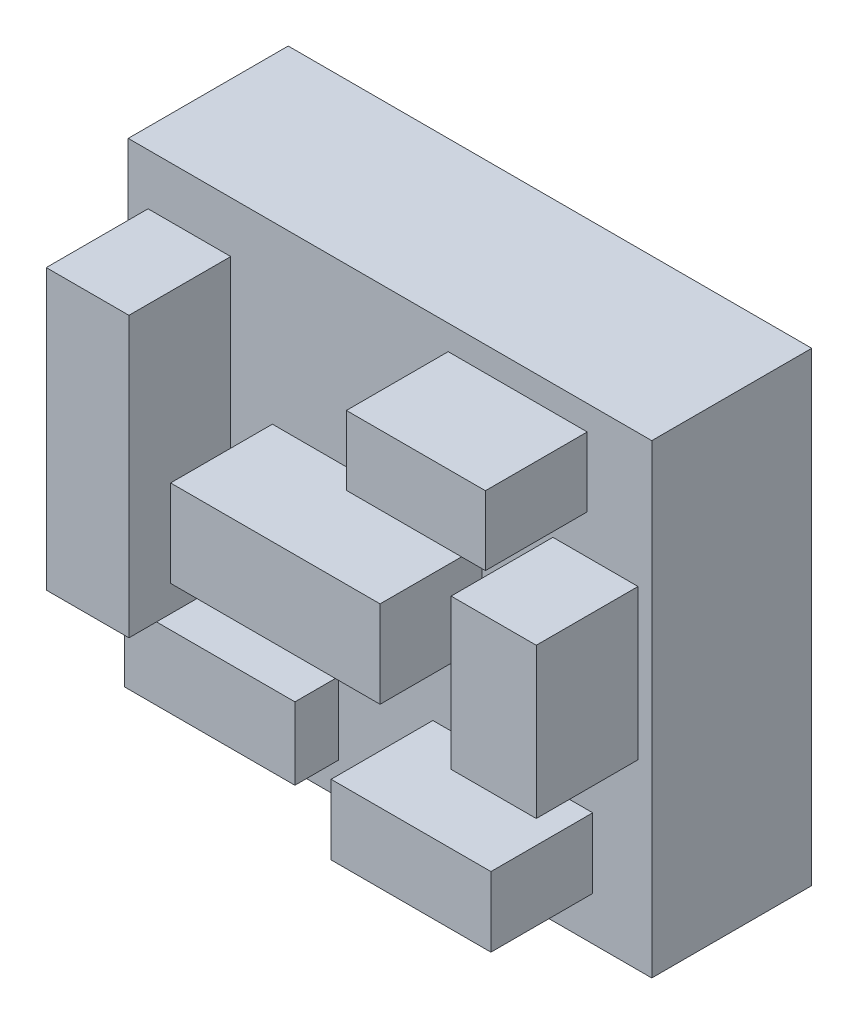
ISO-10303-21;
HEADER;
FILE_DESCRIPTION(('STEP AP214'),'2;1');
FILE_NAME('part.step','',(''),(''),'','','');
FILE_SCHEMA(('AUTOMOTIVE_DESIGN { 1 0 10303 214 1 1 1 1 }'));
ENDSEC;
DATA;
#1=APPLICATION_CONTEXT('core data for automotive mechanical design processes');
#2=APPLICATION_PROTOCOL_DEFINITION('international standard','automotive_design',2000,#1);
#3=PRODUCT_CONTEXT('',#1,'mechanical');
#4=PRODUCT('Part','Part','',(#3));
#5=PRODUCT_RELATED_PRODUCT_CATEGORY('part','',(#4));
#6=PRODUCT_DEFINITION_FORMATION('','',#4);
#7=PRODUCT_DEFINITION_CONTEXT('part definition',#1,'design');
#8=PRODUCT_DEFINITION('design','',#6,#7);
#9=PRODUCT_DEFINITION_SHAPE('','',#8);
#10=(LENGTH_UNIT() NAMED_UNIT(*) SI_UNIT(.MILLI.,.METRE.));
#11=(NAMED_UNIT(*) PLANE_ANGLE_UNIT() SI_UNIT($,.RADIAN.));
#12=(NAMED_UNIT(*) SI_UNIT($,.STERADIAN.) SOLID_ANGLE_UNIT());
#13=UNCERTAINTY_MEASURE_WITH_UNIT(LENGTH_MEASURE(1.E-05),#10,'distance_accuracy_value','');
#14=(GEOMETRIC_REPRESENTATION_CONTEXT(3) GLOBAL_UNCERTAINTY_ASSIGNED_CONTEXT((#13)) GLOBAL_UNIT_ASSIGNED_CONTEXT((#10,
#11,#12)) REPRESENTATION_CONTEXT('',''));
#15=CARTESIAN_POINT('',(0.,0.,0.));
#16=DIRECTION('',(0.,0.,1.));
#17=DIRECTION('',(1.,0.,0.));
#18=AXIS2_PLACEMENT_3D('',#15,#16,#17);
#19=CARTESIAN_POINT('',(0.,0.,13.97));
#20=DIRECTION('',(0.,0.,1.));
#21=DIRECTION('',(1.,0.,0.));
#22=AXIS2_PLACEMENT_3D('',#19,#20,#21);
#23=PLANE('',#22);
#24=DIRECTION('',(0.,-1.,0.));
#25=VECTOR('',#24,1.);
#26=CARTESIAN_POINT('',(-22.86,-20.32,13.97));
#27=LINE('',#26,#25);
#28=CARTESIAN_POINT('',(-22.86,20.32,13.97));
#29=VERTEX_POINT('',#28);
#30=CARTESIAN_POINT('',(-22.86,-20.32,13.97));
#31=VERTEX_POINT('',#30);
#32=EDGE_CURVE('E394',#29,#31,#27,.T.);
#33=ORIENTED_EDGE('',*,*,#32,.T.);
#34=DIRECTION('',(1.,0.,0.));
#35=VECTOR('',#34,1.);
#36=CARTESIAN_POINT('',(22.86,-20.32,13.97));
#37=LINE('',#36,#35);
#38=CARTESIAN_POINT('',(22.86,-20.32,13.97));
#39=VERTEX_POINT('',#38);
#40=EDGE_CURVE('E397',#31,#39,#37,.T.);
#41=ORIENTED_EDGE('',*,*,#40,.T.);
#42=DIRECTION('',(0.,1.,0.));
#43=VECTOR('',#42,1.);
#44=CARTESIAN_POINT('',(22.86,-20.32,13.97));
#45=LINE('',#44,#43);
#46=CARTESIAN_POINT('',(22.86,20.32,13.97));
#47=VERTEX_POINT('',#46);
#48=EDGE_CURVE('E400',#39,#47,#45,.T.);
#49=ORIENTED_EDGE('',*,*,#48,.T.);
#50=DIRECTION('',(-1.,0.,0.));
#51=VECTOR('',#50,1.);
#52=CARTESIAN_POINT('',(22.86,20.32,13.97));
#53=LINE('',#52,#51);
#54=EDGE_CURVE('E402',#47,#29,#53,.T.);
#55=ORIENTED_EDGE('',*,*,#54,.T.);
#56=EDGE_LOOP('',(#33,#41,#49,#55));
#57=FACE_BOUND('',#56,.T.);
#58=DIRECTION('',(1.,0.,0.));
#59=VECTOR('',#58,1.);
#60=CARTESIAN_POINT('',(-21.1277911757091,-8.53134858867236,13.97));
#61=LINE('',#60,#59);
#62=CARTESIAN_POINT('',(-21.1277911757091,-8.53134858867236,13.97));
#63=VERTEX_POINT('',#62);
#64=CARTESIAN_POINT('',(-13.9069005207199,-8.53134858867236,13.97));
#65=VERTEX_POINT('',#64);
#66=EDGE_CURVE('E378',#63,#65,#61,.T.);
#67=ORIENTED_EDGE('',*,*,#66,.F.);
#68=DIRECTION('',(0.,-1.,0.));
#69=VECTOR('',#68,1.);
#70=CARTESIAN_POINT('',(-21.1277911757091,15.8592154015133,13.97));
#71=LINE('',#70,#69);
#72=CARTESIAN_POINT('',(-21.1277911757091,15.8592154015133,13.97));
#73=VERTEX_POINT('',#72);
#74=EDGE_CURVE('E364',#73,#63,#71,.T.);
#75=ORIENTED_EDGE('',*,*,#74,.F.);
#76=DIRECTION('',(-1.,0.,0.));
#77=VECTOR('',#76,1.);
#78=CARTESIAN_POINT('',(-21.1277911757091,15.8592154015133,13.97));
#79=LINE('',#78,#77);
#80=CARTESIAN_POINT('',(-13.9069005207199,15.8592154015133,13.97));
#81=VERTEX_POINT('',#80);
#82=EDGE_CURVE('E369',#81,#73,#79,.T.);
#83=ORIENTED_EDGE('',*,*,#82,.F.);
#84=DIRECTION('',(0.,1.,0.));
#85=VECTOR('',#84,1.);
#86=CARTESIAN_POINT('',(-13.9069005207199,15.8592154015133,13.97));
#87=LINE('',#86,#85);
#88=EDGE_CURVE('E380',#65,#81,#87,.T.);
#89=ORIENTED_EDGE('',*,*,#88,.F.);
#90=EDGE_LOOP('',(#67,#75,#83,#89));
#91=FACE_BOUND('',#90,.T.);
#92=DIRECTION('',(1.,0.,0.));
#93=VECTOR('',#92,1.);
#94=CARTESIAN_POINT('',(5.08136749795535,12.1150498767041,13.97));
#95=LINE('',#94,#93);
#96=CARTESIAN_POINT('',(5.08136749795535,12.1150498767041,13.97));
#97=VERTEX_POINT('',#96);
#98=CARTESIAN_POINT('',(17.2231614141223,12.1150498767041,13.97));
#99=VERTEX_POINT('',#98);
#100=EDGE_CURVE('E349',#97,#99,#95,.T.);
#101=ORIENTED_EDGE('',*,*,#100,.F.);
#102=DIRECTION('',(0.,-1.,0.));
#103=VECTOR('',#102,1.);
#104=CARTESIAN_POINT('',(5.08136749795535,18.1592027953247,13.97));
#105=LINE('',#104,#103);
#106=CARTESIAN_POINT('',(5.08136749795535,18.1592027953247,13.97));
#107=VERTEX_POINT('',#106);
#108=EDGE_CURVE('E335',#107,#97,#105,.T.);
#109=ORIENTED_EDGE('',*,*,#108,.F.);
#110=DIRECTION('',(-1.,0.,0.));
#111=VECTOR('',#110,1.);
#112=CARTESIAN_POINT('',(5.08136749795535,18.1592027953247,13.97));
#113=LINE('',#112,#111);
#114=CARTESIAN_POINT('',(17.2231614141223,18.1592027953247,13.97));
#115=VERTEX_POINT('',#114);
#116=EDGE_CURVE('E340',#115,#107,#113,.T.);
#117=ORIENTED_EDGE('',*,*,#116,.F.);
#118=DIRECTION('',(0.,1.,0.));
#119=VECTOR('',#118,1.);
#120=CARTESIAN_POINT('',(17.2231614141223,18.1592027953247,13.97));
#121=LINE('',#120,#119);
#122=EDGE_CURVE('E351',#99,#115,#121,.T.);
#123=ORIENTED_EDGE('',*,*,#122,.F.);
#124=EDGE_LOOP('',(#101,#109,#117,#123));
#125=FACE_BOUND('',#124,.T.);
#126=DIRECTION('',(1.,0.,0.));
#127=VECTOR('',#126,1.);
#128=CARTESIAN_POINT('',(14.227828994275,-4.41276651138223,13.97));
#129=LINE('',#128,#127);
#130=CARTESIAN_POINT('',(14.227828994275,-4.41276651138223,13.97));
#131=VERTEX_POINT('',#130);
#132=CARTESIAN_POINT('',(21.6626719649675,-4.41276651138223,13.97));
#133=VERTEX_POINT('',#132);
#134=EDGE_CURVE('E320',#131,#133,#129,.T.);
#135=ORIENTED_EDGE('',*,*,#134,.F.);
#136=DIRECTION('',(0.,-1.,0.));
#137=VECTOR('',#136,1.);
#138=CARTESIAN_POINT('',(14.227828994275,8.69181282544999,13.97));
#139=LINE('',#138,#137);
#140=CARTESIAN_POINT('',(14.227828994275,8.69181282544999,13.97));
#141=VERTEX_POINT('',#140);
#142=EDGE_CURVE('E306',#141,#131,#139,.T.);
#143=ORIENTED_EDGE('',*,*,#142,.F.);
#144=DIRECTION('',(-1.,0.,0.));
#145=VECTOR('',#144,1.);
#146=CARTESIAN_POINT('',(14.227828994275,8.69181282544999,13.97));
#147=LINE('',#146,#145);
#148=CARTESIAN_POINT('',(21.6626719649675,8.69181282544999,13.97));
#149=VERTEX_POINT('',#148);
#150=EDGE_CURVE('E311',#149,#141,#147,.T.);
#151=ORIENTED_EDGE('',*,*,#150,.F.);
#152=DIRECTION('',(0.,1.,0.));
#153=VECTOR('',#152,1.);
#154=CARTESIAN_POINT('',(21.6626719649675,8.69181282544999,13.97));
#155=LINE('',#154,#153);
#156=EDGE_CURVE('E322',#133,#149,#155,.T.);
#157=ORIENTED_EDGE('',*,*,#156,.F.);
#158=EDGE_LOOP('',(#135,#143,#151,#157));
#159=FACE_BOUND('',#158,.T.);
#160=DIRECTION('',(1.,0.,0.));
#161=VECTOR('',#160,1.);
#162=CARTESIAN_POINT('',(3.7441655248092,-16.5010723486234,13.97));
#163=LINE('',#162,#161);
#164=CARTESIAN_POINT('',(3.7441655248092,-16.5010723486234,13.97));
#165=VERTEX_POINT('',#164);
#166=CARTESIAN_POINT('',(17.704554124455,-16.5010723486234,13.97));
#167=VERTEX_POINT('',#166);
#168=EDGE_CURVE('E291',#165,#167,#163,.T.);
#169=ORIENTED_EDGE('',*,*,#168,.F.);
#170=DIRECTION('',(0.,-1.,0.));
#171=VECTOR('',#170,1.);
#172=CARTESIAN_POINT('',(3.7441655248092,-10.403431351077,13.97));
#173=LINE('',#172,#171);
#174=CARTESIAN_POINT('',(3.7441655248092,-10.403431351077,13.97));
#175=VERTEX_POINT('',#174);
#176=EDGE_CURVE('E277',#175,#165,#173,.T.);
#177=ORIENTED_EDGE('',*,*,#176,.F.);
#178=DIRECTION('',(-1.,0.,0.));
#179=VECTOR('',#178,1.);
#180=CARTESIAN_POINT('',(3.7441655248092,-10.403431351077,13.97));
#181=LINE('',#180,#179);
#182=CARTESIAN_POINT('',(17.704554124455,-10.403431351077,13.97));
#183=VERTEX_POINT('',#182);
#184=EDGE_CURVE('E282',#183,#175,#181,.T.);
#185=ORIENTED_EDGE('',*,*,#184,.F.);
#186=DIRECTION('',(0.,1.,0.));
#187=VECTOR('',#186,1.);
#188=CARTESIAN_POINT('',(17.704554124455,-10.403431351077,13.97));
#189=LINE('',#188,#187);
#190=EDGE_CURVE('E293',#167,#183,#189,.T.);
#191=ORIENTED_EDGE('',*,*,#190,.F.);
#192=EDGE_LOOP('',(#169,#177,#185,#191));
#193=FACE_BOUND('',#192,.T.);
#194=DIRECTION('',(1.,0.,0.));
#195=VECTOR('',#194,1.);
#196=CARTESIAN_POINT('',(-10.2697111537624,-2.59417182790348,13.97));
#197=LINE('',#196,#195);
#198=CARTESIAN_POINT('',(-10.2697111537624,-2.59417182790348,13.97));
#199=VERTEX_POINT('',#198);
#200=CARTESIAN_POINT('',(8.02321183887687,-2.59417182790348,13.97));
#201=VERTEX_POINT('',#200);
#202=EDGE_CURVE('E249',#199,#201,#197,.T.);
#203=ORIENTED_EDGE('',*,*,#202,.F.);
#204=DIRECTION('',(0.,-1.,0.));
#205=VECTOR('',#204,1.);
#206=CARTESIAN_POINT('',(-10.2697111537624,5.00113537956662,13.97));
#207=LINE('',#206,#205);
#208=CARTESIAN_POINT('',(-10.2697111537624,5.00113537956662,13.97));
#209=VERTEX_POINT('',#208);
#210=EDGE_CURVE('E246',#209,#199,#207,.T.);
#211=ORIENTED_EDGE('',*,*,#210,.F.);
#212=DIRECTION('',(-1.,0.,0.));
#213=VECTOR('',#212,1.);
#214=CARTESIAN_POINT('',(-10.2697111537624,5.00113537956662,13.97));
#215=LINE('',#214,#213);
#216=CARTESIAN_POINT('',(8.02321183887687,5.00113537956662,13.97));
#217=VERTEX_POINT('',#216);
#218=EDGE_CURVE('E258',#217,#209,#215,.T.);
#219=ORIENTED_EDGE('',*,*,#218,.F.);
#220=DIRECTION('',(0.,1.,0.));
#221=VECTOR('',#220,1.);
#222=CARTESIAN_POINT('',(8.02321183887687,5.00113537956662,13.97));
#223=LINE('',#222,#221);
#224=EDGE_CURVE('E266',#201,#217,#223,.T.);
#225=ORIENTED_EDGE('',*,*,#224,.F.);
#226=EDGE_LOOP('',(#203,#211,#219,#225));
#227=FACE_BOUND('',#226,.T.);
#228=DIRECTION('',(1.,0.,0.));
#229=VECTOR('',#228,1.);
#230=CARTESIAN_POINT('',(-19.3626845711562,-17.5173458482145,13.97));
#231=LINE('',#230,#229);
#232=CARTESIAN_POINT('',(-19.3626845711562,-17.5173458482145,13.97));
#233=VERTEX_POINT('',#232);
#234=CARTESIAN_POINT('',(-4.49299862977105,-17.5173458482145,13.97));
#235=VERTEX_POINT('',#234);
#236=EDGE_CURVE('E785',#233,#235,#231,.T.);
#237=ORIENTED_EDGE('',*,*,#236,.F.);
#238=DIRECTION('',(0.,-1.,0.));
#239=VECTOR('',#238,1.);
#240=CARTESIAN_POINT('',(-19.3626845711562,-11.2057525349647,13.97));
#241=LINE('',#240,#239);
#242=CARTESIAN_POINT('',(-19.3626845711562,-11.2057525349647,13.97));
#243=VERTEX_POINT('',#242);
#244=EDGE_CURVE('E244',#243,#233,#241,.T.);
#245=ORIENTED_EDGE('',*,*,#244,.F.);
#246=DIRECTION('',(-1.,0.,0.));
#247=VECTOR('',#246,1.);
#248=CARTESIAN_POINT('',(-19.3626845711562,-11.2057525349647,13.97));
#249=LINE('',#248,#247);
#250=CARTESIAN_POINT('',(-4.49299862977105,-11.2057525349647,13.97));
#251=VERTEX_POINT('',#250);
#252=EDGE_CURVE('E240',#251,#243,#249,.T.);
#253=ORIENTED_EDGE('',*,*,#252,.F.);
#254=DIRECTION('',(0.,1.,0.));
#255=VECTOR('',#254,1.);
#256=CARTESIAN_POINT('',(-4.49299862977105,-11.2057525349647,13.97));
#257=LINE('',#256,#255);
#258=EDGE_CURVE('E782',#235,#251,#257,.T.);
#259=ORIENTED_EDGE('',*,*,#258,.F.);
#260=EDGE_LOOP('',(#237,#245,#253,#259));
#261=FACE_BOUND('',#260,.T.);
#262=ADVANCED_FACE('F35',(#57,#91,#125,#159,#193,#227,#261),#23,.T.);
#263=CARTESIAN_POINT('',(-22.86,-20.32,13.97));
#264=DIRECTION('',(1.,0.,0.));
#265=DIRECTION('',(0.,0.,-1.));
#266=AXIS2_PLACEMENT_3D('',#263,#264,#265);
#267=PLANE('',#266);
#268=DIRECTION('',(0.,-1.,0.));
#269=VECTOR('',#268,1.);
#270=CARTESIAN_POINT('',(-22.86,-20.32,0.));
#271=LINE('',#270,#269);
#272=CARTESIAN_POINT('',(-22.86,20.32,0.));
#273=VERTEX_POINT('',#272);
#274=CARTESIAN_POINT('',(-22.86,-20.32,0.));
#275=VERTEX_POINT('',#274);
#276=EDGE_CURVE('E393',#273,#275,#271,.T.);
#277=ORIENTED_EDGE('',*,*,#276,.T.);
#278=DIRECTION('',(0.,0.,-1.));
#279=VECTOR('',#278,1.);
#280=CARTESIAN_POINT('',(-22.86,-20.32,13.97));
#281=LINE('',#280,#279);
#282=EDGE_CURVE('E11',#31,#275,#281,.T.);
#283=ORIENTED_EDGE('',*,*,#282,.F.);
#284=ORIENTED_EDGE('',*,*,#32,.F.);
#285=DIRECTION('',(0.,0.,-1.));
#286=VECTOR('',#285,1.);
#287=CARTESIAN_POINT('',(-22.86,20.32,13.97));
#288=LINE('',#287,#286);
#289=EDGE_CURVE('E404',#29,#273,#288,.T.);
#290=ORIENTED_EDGE('',*,*,#289,.T.);
#291=EDGE_LOOP('',(#277,#283,#284,#290));
#292=FACE_BOUND('',#291,.T.);
#293=ADVANCED_FACE('F37',(#292),#267,.F.);
#294=CARTESIAN_POINT('',(22.86,-20.32,13.97));
#295=DIRECTION('',(0.,1.,0.));
#296=DIRECTION('',(-1.,0.,0.));
#297=AXIS2_PLACEMENT_3D('',#294,#295,#296);
#298=PLANE('',#297);
#299=DIRECTION('',(1.,0.,0.));
#300=VECTOR('',#299,1.);
#301=CARTESIAN_POINT('',(22.86,-20.32,0.));
#302=LINE('',#301,#300);
#303=CARTESIAN_POINT('',(22.86,-20.32,0.));
#304=VERTEX_POINT('',#303);
#305=EDGE_CURVE('E407',#275,#304,#302,.T.);
#306=ORIENTED_EDGE('',*,*,#305,.T.);
#307=DIRECTION('',(0.,0.,-1.));
#308=VECTOR('',#307,1.);
#309=CARTESIAN_POINT('',(22.86,-20.32,13.97));
#310=LINE('',#309,#308);
#311=EDGE_CURVE('E43',#39,#304,#310,.T.);
#312=ORIENTED_EDGE('',*,*,#311,.F.);
#313=ORIENTED_EDGE('',*,*,#40,.F.);
#314=ORIENTED_EDGE('',*,*,#282,.T.);
#315=EDGE_LOOP('',(#306,#312,#313,#314));
#316=FACE_BOUND('',#315,.T.);
#317=ADVANCED_FACE('F437',(#316),#298,.F.);
#318=CARTESIAN_POINT('',(22.86,-20.32,13.97));
#319=DIRECTION('',(-1.,0.,0.));
#320=DIRECTION('',(0.,0.,1.));
#321=AXIS2_PLACEMENT_3D('',#318,#319,#320);
#322=PLANE('',#321);
#323=DIRECTION('',(0.,1.,0.));
#324=VECTOR('',#323,1.);
#325=CARTESIAN_POINT('',(22.86,-20.32,0.));
#326=LINE('',#325,#324);
#327=CARTESIAN_POINT('',(22.86,20.32,0.));
#328=VERTEX_POINT('',#327);
#329=EDGE_CURVE('E409',#304,#328,#326,.T.);
#330=ORIENTED_EDGE('',*,*,#329,.T.);
#331=DIRECTION('',(0.,0.,-1.));
#332=VECTOR('',#331,1.);
#333=CARTESIAN_POINT('',(22.86,20.32,13.97));
#334=LINE('',#333,#332);
#335=EDGE_CURVE('E414',#47,#328,#334,.T.);
#336=ORIENTED_EDGE('',*,*,#335,.F.);
#337=ORIENTED_EDGE('',*,*,#48,.F.);
#338=ORIENTED_EDGE('',*,*,#311,.T.);
#339=EDGE_LOOP('',(#330,#336,#337,#338));
#340=FACE_BOUND('',#339,.T.);
#341=ADVANCED_FACE('F421',(#340),#322,.F.);
#342=CARTESIAN_POINT('',(22.86,20.32,13.97));
#343=DIRECTION('',(0.,-1.,0.));
#344=DIRECTION('',(1.,0.,0.));
#345=AXIS2_PLACEMENT_3D('',#342,#343,#344);
#346=PLANE('',#345);
#347=DIRECTION('',(-1.,0.,0.));
#348=VECTOR('',#347,1.);
#349=CARTESIAN_POINT('',(22.86,20.32,0.));
#350=LINE('',#349,#348);
#351=EDGE_CURVE('E398',#328,#273,#350,.T.);
#352=ORIENTED_EDGE('',*,*,#351,.T.);
#353=ORIENTED_EDGE('',*,*,#289,.F.);
#354=ORIENTED_EDGE('',*,*,#54,.F.);
#355=ORIENTED_EDGE('',*,*,#335,.T.);
#356=EDGE_LOOP('',(#352,#353,#354,#355));
#357=FACE_BOUND('',#356,.T.);
#358=ADVANCED_FACE('F430',(#357),#346,.F.);
#359=CARTESIAN_POINT('',(0.,0.,0.));
#360=DIRECTION('',(0.,0.,1.));
#361=DIRECTION('',(1.,0.,0.));
#362=AXIS2_PLACEMENT_3D('',#359,#360,#361);
#363=PLANE('',#362);
#364=ORIENTED_EDGE('',*,*,#276,.F.);
#365=ORIENTED_EDGE('',*,*,#351,.F.);
#366=ORIENTED_EDGE('',*,*,#329,.F.);
#367=ORIENTED_EDGE('',*,*,#305,.F.);
#368=EDGE_LOOP('',(#364,#365,#366,#367));
#369=FACE_BOUND('',#368,.T.);
#370=ADVANCED_FACE('F427',(#369),#363,.F.);
#371=CARTESIAN_POINT('',(-21.1277911757091,15.8592154015133,22.86));
#372=DIRECTION('',(1.,0.,0.));
#373=DIRECTION('',(0.,0.,-1.));
#374=AXIS2_PLACEMENT_3D('',#371,#372,#373);
#375=PLANE('',#374);
#376=ORIENTED_EDGE('',*,*,#74,.T.);
#377=DIRECTION('',(0.,0.,-1.));
#378=VECTOR('',#377,1.);
#379=CARTESIAN_POINT('',(-21.1277911757091,-8.53134858867236,22.86));
#380=LINE('',#379,#378);
#381=CARTESIAN_POINT('',(-21.1277911757091,-8.53134858867236,22.86));
#382=VERTEX_POINT('',#381);
#383=EDGE_CURVE('E391',#382,#63,#380,.T.);
#384=ORIENTED_EDGE('',*,*,#383,.F.);
#385=DIRECTION('',(0.,-1.,0.));
#386=VECTOR('',#385,1.);
#387=CARTESIAN_POINT('',(-21.1277911757091,15.8592154015133,22.86));
#388=LINE('',#387,#386);
#389=CARTESIAN_POINT('',(-21.1277911757091,15.8592154015133,22.86));
#390=VERTEX_POINT('',#389);
#391=EDGE_CURVE('E365',#390,#382,#388,.T.);
#392=ORIENTED_EDGE('',*,*,#391,.F.);
#393=DIRECTION('',(0.,0.,-1.));
#394=VECTOR('',#393,1.);
#395=CARTESIAN_POINT('',(-21.1277911757091,15.8592154015133,22.86));
#396=LINE('',#395,#394);
#397=EDGE_CURVE('E375',#390,#73,#396,.T.);
#398=ORIENTED_EDGE('',*,*,#397,.T.);
#399=EDGE_LOOP('',(#376,#384,#392,#398));
#400=FACE_BOUND('',#399,.T.);
#401=ADVANCED_FACE('F450',(#400),#375,.F.);
#402=CARTESIAN_POINT('',(-21.1277911757091,-8.53134858867236,22.86));
#403=DIRECTION('',(0.,1.,0.));
#404=DIRECTION('',(0.,0.,1.));
#405=AXIS2_PLACEMENT_3D('',#402,#403,#404);
#406=PLANE('',#405);
#407=ORIENTED_EDGE('',*,*,#66,.T.);
#408=DIRECTION('',(0.,0.,-1.));
#409=VECTOR('',#408,1.);
#410=CARTESIAN_POINT('',(-13.9069005207199,-8.53134858867236,22.86));
#411=LINE('',#410,#409);
#412=CARTESIAN_POINT('',(-13.9069005207199,-8.53134858867236,22.86));
#413=VERTEX_POINT('',#412);
#414=EDGE_CURVE('E388',#413,#65,#411,.T.);
#415=ORIENTED_EDGE('',*,*,#414,.F.);
#416=DIRECTION('',(1.,0.,0.));
#417=VECTOR('',#416,1.);
#418=CARTESIAN_POINT('',(-21.1277911757091,-8.53134858867236,22.86));
#419=LINE('',#418,#417);
#420=EDGE_CURVE('E368',#382,#413,#419,.T.);
#421=ORIENTED_EDGE('',*,*,#420,.F.);
#422=ORIENTED_EDGE('',*,*,#383,.T.);
#423=EDGE_LOOP('',(#407,#415,#421,#422));
#424=FACE_BOUND('',#423,.T.);
#425=ADVANCED_FACE('F469',(#424),#406,.F.);
#426=CARTESIAN_POINT('',(-13.9069005207199,15.8592154015133,22.86));
#427=DIRECTION('',(-1.,0.,0.));
#428=DIRECTION('',(0.,0.,1.));
#429=AXIS2_PLACEMENT_3D('',#426,#427,#428);
#430=PLANE('',#429);
#431=ORIENTED_EDGE('',*,*,#88,.T.);
#432=DIRECTION('',(0.,0.,-1.));
#433=VECTOR('',#432,1.);
#434=CARTESIAN_POINT('',(-13.9069005207199,15.8592154015133,22.86));
#435=LINE('',#434,#433);
#436=CARTESIAN_POINT('',(-13.9069005207199,15.8592154015133,22.86));
#437=VERTEX_POINT('',#436);
#438=EDGE_CURVE('E386',#437,#81,#435,.T.);
#439=ORIENTED_EDGE('',*,*,#438,.F.);
#440=DIRECTION('',(0.,1.,0.));
#441=VECTOR('',#440,1.);
#442=CARTESIAN_POINT('',(-13.9069005207199,15.8592154015133,22.86));
#443=LINE('',#442,#441);
#444=EDGE_CURVE('E371',#413,#437,#443,.T.);
#445=ORIENTED_EDGE('',*,*,#444,.F.);
#446=ORIENTED_EDGE('',*,*,#414,.T.);
#447=EDGE_LOOP('',(#431,#439,#445,#446));
#448=FACE_BOUND('',#447,.T.);
#449=ADVANCED_FACE('F476',(#448),#430,.F.);
#450=CARTESIAN_POINT('',(-21.1277911757091,15.8592154015133,22.86));
#451=DIRECTION('',(0.,-1.,0.));
#452=DIRECTION('',(0.,0.,-1.));
#453=AXIS2_PLACEMENT_3D('',#450,#451,#452);
#454=PLANE('',#453);
#455=ORIENTED_EDGE('',*,*,#82,.T.);
#456=ORIENTED_EDGE('',*,*,#397,.F.);
#457=DIRECTION('',(-1.,0.,0.));
#458=VECTOR('',#457,1.);
#459=CARTESIAN_POINT('',(-21.1277911757091,15.8592154015133,22.86));
#460=LINE('',#459,#458);
#461=EDGE_CURVE('E373',#437,#390,#460,.T.);
#462=ORIENTED_EDGE('',*,*,#461,.F.);
#463=ORIENTED_EDGE('',*,*,#438,.T.);
#464=EDGE_LOOP('',(#455,#456,#462,#463));
#465=FACE_BOUND('',#464,.T.);
#466=ADVANCED_FACE('F483',(#465),#454,.F.);
#467=CARTESIAN_POINT('',(0.,0.,22.86));
#468=DIRECTION('',(0.,0.,1.));
#469=DIRECTION('',(1.,0.,0.));
#470=AXIS2_PLACEMENT_3D('',#467,#468,#469);
#471=PLANE('',#470);
#472=ORIENTED_EDGE('',*,*,#391,.T.);
#473=ORIENTED_EDGE('',*,*,#420,.T.);
#474=ORIENTED_EDGE('',*,*,#444,.T.);
#475=ORIENTED_EDGE('',*,*,#461,.T.);
#476=EDGE_LOOP('',(#472,#473,#474,#475));
#477=FACE_BOUND('',#476,.T.);
#478=ADVANCED_FACE('F491',(#477),#471,.T.);
#479=CARTESIAN_POINT('',(5.08136749795535,18.1592027953247,22.86));
#480=DIRECTION('',(1.,0.,0.));
#481=DIRECTION('',(0.,0.,-1.));
#482=AXIS2_PLACEMENT_3D('',#479,#480,#481);
#483=PLANE('',#482);
#484=ORIENTED_EDGE('',*,*,#108,.T.);
#485=DIRECTION('',(0.,0.,-1.));
#486=VECTOR('',#485,1.);
#487=CARTESIAN_POINT('',(5.08136749795535,12.1150498767041,22.86));
#488=LINE('',#487,#486);
#489=CARTESIAN_POINT('',(5.08136749795535,12.1150498767041,22.86));
#490=VERTEX_POINT('',#489);
#491=EDGE_CURVE('E362',#490,#97,#488,.T.);
#492=ORIENTED_EDGE('',*,*,#491,.F.);
#493=DIRECTION('',(0.,-1.,0.));
#494=VECTOR('',#493,1.);
#495=CARTESIAN_POINT('',(5.08136749795535,18.1592027953247,22.86));
#496=LINE('',#495,#494);
#497=CARTESIAN_POINT('',(5.08136749795535,18.1592027953247,22.86));
#498=VERTEX_POINT('',#497);
#499=EDGE_CURVE('E336',#498,#490,#496,.T.);
#500=ORIENTED_EDGE('',*,*,#499,.F.);
#501=DIRECTION('',(0.,0.,-1.));
#502=VECTOR('',#501,1.);
#503=CARTESIAN_POINT('',(5.08136749795535,18.1592027953247,22.86));
#504=LINE('',#503,#502);
#505=EDGE_CURVE('E346',#498,#107,#504,.T.);
#506=ORIENTED_EDGE('',*,*,#505,.T.);
#507=EDGE_LOOP('',(#484,#492,#500,#506));
#508=FACE_BOUND('',#507,.T.);
#509=ADVANCED_FACE('F499',(#508),#483,.F.);
#510=CARTESIAN_POINT('',(5.08136749795535,12.1150498767041,22.86));
#511=DIRECTION('',(0.,1.,0.));
#512=DIRECTION('',(0.,0.,1.));
#513=AXIS2_PLACEMENT_3D('',#510,#511,#512);
#514=PLANE('',#513);
#515=ORIENTED_EDGE('',*,*,#100,.T.);
#516=DIRECTION('',(0.,0.,-1.));
#517=VECTOR('',#516,1.);
#518=CARTESIAN_POINT('',(17.2231614141223,12.1150498767041,22.86));
#519=LINE('',#518,#517);
#520=CARTESIAN_POINT('',(17.2231614141223,12.1150498767041,22.86));
#521=VERTEX_POINT('',#520);
#522=EDGE_CURVE('E359',#521,#99,#519,.T.);
#523=ORIENTED_EDGE('',*,*,#522,.F.);
#524=DIRECTION('',(1.,0.,0.));
#525=VECTOR('',#524,1.);
#526=CARTESIAN_POINT('',(5.08136749795535,12.1150498767041,22.86));
#527=LINE('',#526,#525);
#528=EDGE_CURVE('E339',#490,#521,#527,.T.);
#529=ORIENTED_EDGE('',*,*,#528,.F.);
#530=ORIENTED_EDGE('',*,*,#491,.T.);
#531=EDGE_LOOP('',(#515,#523,#529,#530));
#532=FACE_BOUND('',#531,.T.);
#533=ADVANCED_FACE('F507',(#532),#514,.F.);
#534=CARTESIAN_POINT('',(17.2231614141223,18.1592027953247,22.86));
#535=DIRECTION('',(-1.,0.,0.));
#536=DIRECTION('',(0.,-1.,0.));
#537=AXIS2_PLACEMENT_3D('',#534,#535,#536);
#538=PLANE('',#537);
#539=ORIENTED_EDGE('',*,*,#122,.T.);
#540=DIRECTION('',(0.,0.,-1.));
#541=VECTOR('',#540,1.);
#542=CARTESIAN_POINT('',(17.2231614141223,18.1592027953247,22.86));
#543=LINE('',#542,#541);
#544=CARTESIAN_POINT('',(17.2231614141223,18.1592027953247,22.86));
#545=VERTEX_POINT('',#544);
#546=EDGE_CURVE('E357',#545,#115,#543,.T.);
#547=ORIENTED_EDGE('',*,*,#546,.F.);
#548=DIRECTION('',(0.,1.,0.));
#549=VECTOR('',#548,1.);
#550=CARTESIAN_POINT('',(17.2231614141223,18.1592027953247,22.86));
#551=LINE('',#550,#549);
#552=EDGE_CURVE('E342',#521,#545,#551,.T.);
#553=ORIENTED_EDGE('',*,*,#552,.F.);
#554=ORIENTED_EDGE('',*,*,#522,.T.);
#555=EDGE_LOOP('',(#539,#547,#553,#554));
#556=FACE_BOUND('',#555,.T.);
#557=ADVANCED_FACE('F515',(#556),#538,.F.);
#558=CARTESIAN_POINT('',(5.08136749795535,18.1592027953247,22.86));
#559=DIRECTION('',(0.,-1.,0.));
#560=DIRECTION('',(0.,0.,-1.));
#561=AXIS2_PLACEMENT_3D('',#558,#559,#560);
#562=PLANE('',#561);
#563=ORIENTED_EDGE('',*,*,#116,.T.);
#564=ORIENTED_EDGE('',*,*,#505,.F.);
#565=DIRECTION('',(-1.,0.,0.));
#566=VECTOR('',#565,1.);
#567=CARTESIAN_POINT('',(5.08136749795535,18.1592027953247,22.86));
#568=LINE('',#567,#566);
#569=EDGE_CURVE('E344',#545,#498,#568,.T.);
#570=ORIENTED_EDGE('',*,*,#569,.F.);
#571=ORIENTED_EDGE('',*,*,#546,.T.);
#572=EDGE_LOOP('',(#563,#564,#570,#571));
#573=FACE_BOUND('',#572,.T.);
#574=ADVANCED_FACE('F523',(#573),#562,.F.);
#575=CARTESIAN_POINT('',(0.,0.,22.86));
#576=DIRECTION('',(0.,0.,1.));
#577=DIRECTION('',(1.,0.,0.));
#578=AXIS2_PLACEMENT_3D('',#575,#576,#577);
#579=PLANE('',#578);
#580=ORIENTED_EDGE('',*,*,#499,.T.);
#581=ORIENTED_EDGE('',*,*,#528,.T.);
#582=ORIENTED_EDGE('',*,*,#552,.T.);
#583=ORIENTED_EDGE('',*,*,#569,.T.);
#584=EDGE_LOOP('',(#580,#581,#582,#583));
#585=FACE_BOUND('',#584,.T.);
#586=ADVANCED_FACE('F531',(#585),#579,.T.);
#587=CARTESIAN_POINT('',(14.227828994275,8.69181282544999,22.86));
#588=DIRECTION('',(1.,0.,0.));
#589=DIRECTION('',(0.,0.,-1.));
#590=AXIS2_PLACEMENT_3D('',#587,#588,#589);
#591=PLANE('',#590);
#592=ORIENTED_EDGE('',*,*,#142,.T.);
#593=DIRECTION('',(0.,0.,-1.));
#594=VECTOR('',#593,1.);
#595=CARTESIAN_POINT('',(14.227828994275,-4.41276651138223,22.86));
#596=LINE('',#595,#594);
#597=CARTESIAN_POINT('',(14.227828994275,-4.41276651138223,22.86));
#598=VERTEX_POINT('',#597);
#599=EDGE_CURVE('E333',#598,#131,#596,.T.);
#600=ORIENTED_EDGE('',*,*,#599,.F.);
#601=DIRECTION('',(0.,-1.,0.));
#602=VECTOR('',#601,1.);
#603=CARTESIAN_POINT('',(14.227828994275,8.69181282544999,22.86));
#604=LINE('',#603,#602);
#605=CARTESIAN_POINT('',(14.227828994275,8.69181282544999,22.86));
#606=VERTEX_POINT('',#605);
#607=EDGE_CURVE('E307',#606,#598,#604,.T.);
#608=ORIENTED_EDGE('',*,*,#607,.F.);
#609=DIRECTION('',(0.,0.,-1.));
#610=VECTOR('',#609,1.);
#611=CARTESIAN_POINT('',(14.227828994275,8.69181282544999,22.86));
#612=LINE('',#611,#610);
#613=EDGE_CURVE('E317',#606,#141,#612,.T.);
#614=ORIENTED_EDGE('',*,*,#613,.T.);
#615=EDGE_LOOP('',(#592,#600,#608,#614));
#616=FACE_BOUND('',#615,.T.);
#617=ADVANCED_FACE('F539',(#616),#591,.F.);
#618=CARTESIAN_POINT('',(14.227828994275,-4.41276651138223,22.86));
#619=DIRECTION('',(0.,1.,0.));
#620=DIRECTION('',(0.,0.,1.));
#621=AXIS2_PLACEMENT_3D('',#618,#619,#620);
#622=PLANE('',#621);
#623=ORIENTED_EDGE('',*,*,#134,.T.);
#624=DIRECTION('',(0.,0.,-1.));
#625=VECTOR('',#624,1.);
#626=CARTESIAN_POINT('',(21.6626719649675,-4.41276651138223,22.86));
#627=LINE('',#626,#625);
#628=CARTESIAN_POINT('',(21.6626719649675,-4.41276651138223,22.86));
#629=VERTEX_POINT('',#628);
#630=EDGE_CURVE('E330',#629,#133,#627,.T.);
#631=ORIENTED_EDGE('',*,*,#630,.F.);
#632=DIRECTION('',(1.,0.,0.));
#633=VECTOR('',#632,1.);
#634=CARTESIAN_POINT('',(14.227828994275,-4.41276651138223,22.86));
#635=LINE('',#634,#633);
#636=EDGE_CURVE('E310',#598,#629,#635,.T.);
#637=ORIENTED_EDGE('',*,*,#636,.F.);
#638=ORIENTED_EDGE('',*,*,#599,.T.);
#639=EDGE_LOOP('',(#623,#631,#637,#638));
#640=FACE_BOUND('',#639,.T.);
#641=ADVANCED_FACE('F547',(#640),#622,.F.);
#642=CARTESIAN_POINT('',(21.6626719649675,8.69181282544999,22.86));
#643=DIRECTION('',(-1.,0.,0.));
#644=DIRECTION('',(0.,0.,1.));
#645=AXIS2_PLACEMENT_3D('',#642,#643,#644);
#646=PLANE('',#645);
#647=ORIENTED_EDGE('',*,*,#156,.T.);
#648=DIRECTION('',(0.,0.,-1.));
#649=VECTOR('',#648,1.);
#650=CARTESIAN_POINT('',(21.6626719649675,8.69181282544999,22.86));
#651=LINE('',#650,#649);
#652=CARTESIAN_POINT('',(21.6626719649675,8.69181282544999,22.86));
#653=VERTEX_POINT('',#652);
#654=EDGE_CURVE('E328',#653,#149,#651,.T.);
#655=ORIENTED_EDGE('',*,*,#654,.F.);
#656=DIRECTION('',(0.,1.,0.));
#657=VECTOR('',#656,1.);
#658=CARTESIAN_POINT('',(21.6626719649675,8.69181282544999,22.86));
#659=LINE('',#658,#657);
#660=EDGE_CURVE('E313',#629,#653,#659,.T.);
#661=ORIENTED_EDGE('',*,*,#660,.F.);
#662=ORIENTED_EDGE('',*,*,#630,.T.);
#663=EDGE_LOOP('',(#647,#655,#661,#662));
#664=FACE_BOUND('',#663,.T.);
#665=ADVANCED_FACE('F555',(#664),#646,.F.);
#666=CARTESIAN_POINT('',(14.227828994275,8.69181282544999,22.86));
#667=DIRECTION('',(0.,-1.,0.));
#668=DIRECTION('',(0.,0.,-1.));
#669=AXIS2_PLACEMENT_3D('',#666,#667,#668);
#670=PLANE('',#669);
#671=ORIENTED_EDGE('',*,*,#150,.T.);
#672=ORIENTED_EDGE('',*,*,#613,.F.);
#673=DIRECTION('',(-1.,0.,0.));
#674=VECTOR('',#673,1.);
#675=CARTESIAN_POINT('',(14.227828994275,8.69181282544999,22.86));
#676=LINE('',#675,#674);
#677=EDGE_CURVE('E315',#653,#606,#676,.T.);
#678=ORIENTED_EDGE('',*,*,#677,.F.);
#679=ORIENTED_EDGE('',*,*,#654,.T.);
#680=EDGE_LOOP('',(#671,#672,#678,#679));
#681=FACE_BOUND('',#680,.T.);
#682=ADVANCED_FACE('F563',(#681),#670,.F.);
#683=CARTESIAN_POINT('',(0.,0.,22.86));
#684=DIRECTION('',(0.,0.,1.));
#685=DIRECTION('',(1.,0.,0.));
#686=AXIS2_PLACEMENT_3D('',#683,#684,#685);
#687=PLANE('',#686);
#688=ORIENTED_EDGE('',*,*,#607,.T.);
#689=ORIENTED_EDGE('',*,*,#636,.T.);
#690=ORIENTED_EDGE('',*,*,#660,.T.);
#691=ORIENTED_EDGE('',*,*,#677,.T.);
#692=EDGE_LOOP('',(#688,#689,#690,#691));
#693=FACE_BOUND('',#692,.T.);
#694=ADVANCED_FACE('F571',(#693),#687,.T.);
#695=CARTESIAN_POINT('',(3.7441655248092,-10.403431351077,22.86));
#696=DIRECTION('',(1.,0.,0.));
#697=DIRECTION('',(0.,1.,0.));
#698=AXIS2_PLACEMENT_3D('',#695,#696,#697);
#699=PLANE('',#698);
#700=ORIENTED_EDGE('',*,*,#176,.T.);
#701=DIRECTION('',(0.,0.,-1.));
#702=VECTOR('',#701,1.);
#703=CARTESIAN_POINT('',(3.7441655248092,-16.5010723486234,22.86));
#704=LINE('',#703,#702);
#705=CARTESIAN_POINT('',(3.7441655248092,-16.5010723486234,22.86));
#706=VERTEX_POINT('',#705);
#707=EDGE_CURVE('E304',#706,#165,#704,.T.);
#708=ORIENTED_EDGE('',*,*,#707,.F.);
#709=DIRECTION('',(0.,-1.,0.));
#710=VECTOR('',#709,1.);
#711=CARTESIAN_POINT('',(3.7441655248092,-10.403431351077,22.86));
#712=LINE('',#711,#710);
#713=CARTESIAN_POINT('',(3.7441655248092,-10.403431351077,22.86));
#714=VERTEX_POINT('',#713);
#715=EDGE_CURVE('E278',#714,#706,#712,.T.);
#716=ORIENTED_EDGE('',*,*,#715,.F.);
#717=DIRECTION('',(0.,0.,-1.));
#718=VECTOR('',#717,1.);
#719=CARTESIAN_POINT('',(3.7441655248092,-10.403431351077,22.86));
#720=LINE('',#719,#718);
#721=EDGE_CURVE('E288',#714,#175,#720,.T.);
#722=ORIENTED_EDGE('',*,*,#721,.T.);
#723=EDGE_LOOP('',(#700,#708,#716,#722));
#724=FACE_BOUND('',#723,.T.);
#725=ADVANCED_FACE('F579',(#724),#699,.F.);
#726=CARTESIAN_POINT('',(3.7441655248092,-16.5010723486234,22.86));
#727=DIRECTION('',(0.,1.,0.));
#728=DIRECTION('',(0.,0.,1.));
#729=AXIS2_PLACEMENT_3D('',#726,#727,#728);
#730=PLANE('',#729);
#731=ORIENTED_EDGE('',*,*,#168,.T.);
#732=DIRECTION('',(0.,0.,-1.));
#733=VECTOR('',#732,1.);
#734=CARTESIAN_POINT('',(17.704554124455,-16.5010723486234,22.86));
#735=LINE('',#734,#733);
#736=CARTESIAN_POINT('',(17.704554124455,-16.5010723486234,22.86));
#737=VERTEX_POINT('',#736);
#738=EDGE_CURVE('E301',#737,#167,#735,.T.);
#739=ORIENTED_EDGE('',*,*,#738,.F.);
#740=DIRECTION('',(1.,0.,0.));
#741=VECTOR('',#740,1.);
#742=CARTESIAN_POINT('',(3.7441655248092,-16.5010723486234,22.86));
#743=LINE('',#742,#741);
#744=EDGE_CURVE('E281',#706,#737,#743,.T.);
#745=ORIENTED_EDGE('',*,*,#744,.F.);
#746=ORIENTED_EDGE('',*,*,#707,.T.);
#747=EDGE_LOOP('',(#731,#739,#745,#746));
#748=FACE_BOUND('',#747,.T.);
#749=ADVANCED_FACE('F587',(#748),#730,.F.);
#750=CARTESIAN_POINT('',(17.704554124455,-10.403431351077,22.86));
#751=DIRECTION('',(-1.,0.,0.));
#752=DIRECTION('',(0.,0.,1.));
#753=AXIS2_PLACEMENT_3D('',#750,#751,#752);
#754=PLANE('',#753);
#755=ORIENTED_EDGE('',*,*,#190,.T.);
#756=DIRECTION('',(0.,0.,-1.));
#757=VECTOR('',#756,1.);
#758=CARTESIAN_POINT('',(17.704554124455,-10.403431351077,22.86));
#759=LINE('',#758,#757);
#760=CARTESIAN_POINT('',(17.704554124455,-10.403431351077,22.86));
#761=VERTEX_POINT('',#760);
#762=EDGE_CURVE('E299',#761,#183,#759,.T.);
#763=ORIENTED_EDGE('',*,*,#762,.F.);
#764=DIRECTION('',(0.,1.,0.));
#765=VECTOR('',#764,1.);
#766=CARTESIAN_POINT('',(17.704554124455,-10.403431351077,22.86));
#767=LINE('',#766,#765);
#768=EDGE_CURVE('E284',#737,#761,#767,.T.);
#769=ORIENTED_EDGE('',*,*,#768,.F.);
#770=ORIENTED_EDGE('',*,*,#738,.T.);
#771=EDGE_LOOP('',(#755,#763,#769,#770));
#772=FACE_BOUND('',#771,.T.);
#773=ADVANCED_FACE('F595',(#772),#754,.F.);
#774=CARTESIAN_POINT('',(3.7441655248092,-10.403431351077,22.86));
#775=DIRECTION('',(0.,-1.,0.));
#776=DIRECTION('',(0.,0.,-1.));
#777=AXIS2_PLACEMENT_3D('',#774,#775,#776);
#778=PLANE('',#777);
#779=ORIENTED_EDGE('',*,*,#184,.T.);
#780=ORIENTED_EDGE('',*,*,#721,.F.);
#781=DIRECTION('',(-1.,0.,0.));
#782=VECTOR('',#781,1.);
#783=CARTESIAN_POINT('',(3.7441655248092,-10.403431351077,22.86));
#784=LINE('',#783,#782);
#785=EDGE_CURVE('E286',#761,#714,#784,.T.);
#786=ORIENTED_EDGE('',*,*,#785,.F.);
#787=ORIENTED_EDGE('',*,*,#762,.T.);
#788=EDGE_LOOP('',(#779,#780,#786,#787));
#789=FACE_BOUND('',#788,.T.);
#790=ADVANCED_FACE('F603',(#789),#778,.F.);
#791=CARTESIAN_POINT('',(0.,0.,22.86));
#792=DIRECTION('',(0.,0.,1.));
#793=DIRECTION('',(1.,0.,0.));
#794=AXIS2_PLACEMENT_3D('',#791,#792,#793);
#795=PLANE('',#794);
#796=ORIENTED_EDGE('',*,*,#715,.T.);
#797=ORIENTED_EDGE('',*,*,#744,.T.);
#798=ORIENTED_EDGE('',*,*,#768,.T.);
#799=ORIENTED_EDGE('',*,*,#785,.T.);
#800=EDGE_LOOP('',(#796,#797,#798,#799));
#801=FACE_BOUND('',#800,.T.);
#802=ADVANCED_FACE('F611',(#801),#795,.T.);
#803=CARTESIAN_POINT('',(-10.2697111537624,5.00113537956662,22.86));
#804=DIRECTION('',(1.,0.,0.));
#805=DIRECTION('',(0.,0.,-1.));
#806=AXIS2_PLACEMENT_3D('',#803,#804,#805);
#807=PLANE('',#806);
#808=ORIENTED_EDGE('',*,*,#210,.T.);
#809=DIRECTION('',(0.,0.,-1.));
#810=VECTOR('',#809,1.);
#811=CARTESIAN_POINT('',(-10.2697111537624,-2.59417182790348,22.86));
#812=LINE('',#811,#810);
#813=CARTESIAN_POINT('',(-10.2697111537624,-2.59417182790348,22.86));
#814=VERTEX_POINT('',#813);
#815=EDGE_CURVE('E275',#814,#199,#812,.T.);
#816=ORIENTED_EDGE('',*,*,#815,.F.);
#817=DIRECTION('',(0.,-1.,0.));
#818=VECTOR('',#817,1.);
#819=CARTESIAN_POINT('',(-10.2697111537624,5.00113537956662,22.86));
#820=LINE('',#819,#818);
#821=CARTESIAN_POINT('',(-10.2697111537624,5.00113537956662,22.86));
#822=VERTEX_POINT('',#821);
#823=EDGE_CURVE('E254',#822,#814,#820,.T.);
#824=ORIENTED_EDGE('',*,*,#823,.F.);
#825=DIRECTION('',(0.,0.,-1.));
#826=VECTOR('',#825,1.);
#827=CARTESIAN_POINT('',(-10.2697111537624,5.00113537956662,22.86));
#828=LINE('',#827,#826);
#829=EDGE_CURVE('E263',#822,#209,#828,.T.);
#830=ORIENTED_EDGE('',*,*,#829,.T.);
#831=EDGE_LOOP('',(#808,#816,#824,#830));
#832=FACE_BOUND('',#831,.T.);
#833=ADVANCED_FACE('F619',(#832),#807,.F.);
#834=CARTESIAN_POINT('',(-10.2697111537624,-2.59417182790348,22.86));
#835=DIRECTION('',(0.,1.,0.));
#836=DIRECTION('',(0.,0.,1.));
#837=AXIS2_PLACEMENT_3D('',#834,#835,#836);
#838=PLANE('',#837);
#839=ORIENTED_EDGE('',*,*,#202,.T.);
#840=DIRECTION('',(0.,0.,-1.));
#841=VECTOR('',#840,1.);
#842=CARTESIAN_POINT('',(8.02321183887687,-2.59417182790348,22.86));
#843=LINE('',#842,#841);
#844=CARTESIAN_POINT('',(8.02321183887687,-2.59417182790348,22.86));
#845=VERTEX_POINT('',#844);
#846=EDGE_CURVE('E272',#845,#201,#843,.T.);
#847=ORIENTED_EDGE('',*,*,#846,.F.);
#848=DIRECTION('',(1.,0.,0.));
#849=VECTOR('',#848,1.);
#850=CARTESIAN_POINT('',(-10.2697111537624,-2.59417182790348,22.86));
#851=LINE('',#850,#849);
#852=EDGE_CURVE('E257',#814,#845,#851,.T.);
#853=ORIENTED_EDGE('',*,*,#852,.F.);
#854=ORIENTED_EDGE('',*,*,#815,.T.);
#855=EDGE_LOOP('',(#839,#847,#853,#854));
#856=FACE_BOUND('',#855,.T.);
#857=ADVANCED_FACE('F627',(#856),#838,.F.);
#858=CARTESIAN_POINT('',(8.02321183887687,5.00113537956662,22.86));
#859=DIRECTION('',(-1.,0.,0.));
#860=DIRECTION('',(0.,0.,1.));
#861=AXIS2_PLACEMENT_3D('',#858,#859,#860);
#862=PLANE('',#861);
#863=ORIENTED_EDGE('',*,*,#224,.T.);
#864=DIRECTION('',(0.,0.,-1.));
#865=VECTOR('',#864,1.);
#866=CARTESIAN_POINT('',(8.02321183887687,5.00113537956662,22.86));
#867=LINE('',#866,#865);
#868=CARTESIAN_POINT('',(8.02321183887687,5.00113537956662,22.86));
#869=VERTEX_POINT('',#868);
#870=EDGE_CURVE('E58',#869,#217,#867,.T.);
#871=ORIENTED_EDGE('',*,*,#870,.F.);
#872=DIRECTION('',(0.,1.,0.));
#873=VECTOR('',#872,1.);
#874=CARTESIAN_POINT('',(8.02321183887687,5.00113537956662,22.86));
#875=LINE('',#874,#873);
#876=EDGE_CURVE('E260',#845,#869,#875,.T.);
#877=ORIENTED_EDGE('',*,*,#876,.F.);
#878=ORIENTED_EDGE('',*,*,#846,.T.);
#879=EDGE_LOOP('',(#863,#871,#877,#878));
#880=FACE_BOUND('',#879,.T.);
#881=ADVANCED_FACE('F635',(#880),#862,.F.);
#882=CARTESIAN_POINT('',(-10.2697111537624,5.00113537956662,22.86));
#883=DIRECTION('',(0.,-1.,0.));
#884=DIRECTION('',(0.,0.,-1.));
#885=AXIS2_PLACEMENT_3D('',#882,#883,#884);
#886=PLANE('',#885);
#887=ORIENTED_EDGE('',*,*,#218,.T.);
#888=ORIENTED_EDGE('',*,*,#829,.F.);
#889=DIRECTION('',(-1.,0.,0.));
#890=VECTOR('',#889,1.);
#891=CARTESIAN_POINT('',(-10.2697111537624,5.00113537956662,22.86));
#892=LINE('',#891,#890);
#893=EDGE_CURVE('E262',#869,#822,#892,.T.);
#894=ORIENTED_EDGE('',*,*,#893,.F.);
#895=ORIENTED_EDGE('',*,*,#870,.T.);
#896=EDGE_LOOP('',(#887,#888,#894,#895));
#897=FACE_BOUND('',#896,.T.);
#898=ADVANCED_FACE('F643',(#897),#886,.F.);
#899=CARTESIAN_POINT('',(0.,0.,22.86));
#900=DIRECTION('',(0.,0.,1.));
#901=DIRECTION('',(1.,0.,0.));
#902=AXIS2_PLACEMENT_3D('',#899,#900,#901);
#903=PLANE('',#902);
#904=ORIENTED_EDGE('',*,*,#823,.T.);
#905=ORIENTED_EDGE('',*,*,#852,.T.);
#906=ORIENTED_EDGE('',*,*,#876,.T.);
#907=ORIENTED_EDGE('',*,*,#893,.T.);
#908=EDGE_LOOP('',(#904,#905,#906,#907));
#909=FACE_BOUND('',#908,.T.);
#910=ADVANCED_FACE('F651',(#909),#903,.T.);
#911=CARTESIAN_POINT('',(-19.3626845711562,-11.2057525349647,17.78));
#912=DIRECTION('',(1.,0.,0.));
#913=DIRECTION('',(0.,0.,-1.));
#914=AXIS2_PLACEMENT_3D('',#911,#912,#913);
#915=PLANE('',#914);
#916=ORIENTED_EDGE('',*,*,#244,.T.);
#917=DIRECTION('',(0.,0.,-1.));
#918=VECTOR('',#917,1.);
#919=CARTESIAN_POINT('',(-19.3626845711562,-17.5173458482145,17.78));
#920=LINE('',#919,#918);
#921=CARTESIAN_POINT('',(-19.3626845711562,-17.5173458482145,17.78));
#922=VERTEX_POINT('',#921);
#923=EDGE_CURVE('E225',#922,#233,#920,.T.);
#924=ORIENTED_EDGE('',*,*,#923,.F.);
#925=DIRECTION('',(0.,-1.,0.));
#926=VECTOR('',#925,1.);
#927=CARTESIAN_POINT('',(-19.3626845711562,-11.2057525349647,17.78));
#928=LINE('',#927,#926);
#929=CARTESIAN_POINT('',(-19.3626845711562,-11.2057525349647,17.78));
#930=VERTEX_POINT('',#929);
#931=EDGE_CURVE('E232',#930,#922,#928,.T.);
#932=ORIENTED_EDGE('',*,*,#931,.F.);
#933=DIRECTION('',(0.,0.,-1.));
#934=VECTOR('',#933,1.);
#935=CARTESIAN_POINT('',(-19.3626845711562,-11.2057525349647,17.78));
#936=LINE('',#935,#934);
#937=EDGE_CURVE('E779',#930,#243,#936,.T.);
#938=ORIENTED_EDGE('',*,*,#937,.T.);
#939=EDGE_LOOP('',(#916,#924,#932,#938));
#940=FACE_BOUND('',#939,.T.);
#941=ADVANCED_FACE('F242',(#940),#915,.F.);
#942=CARTESIAN_POINT('',(-19.3626845711562,-17.5173458482145,17.78));
#943=DIRECTION('',(0.,1.,0.));
#944=DIRECTION('',(0.,0.,1.));
#945=AXIS2_PLACEMENT_3D('',#942,#943,#944);
#946=PLANE('',#945);
#947=ORIENTED_EDGE('',*,*,#236,.T.);
#948=DIRECTION('',(0.,0.,-1.));
#949=VECTOR('',#948,1.);
#950=CARTESIAN_POINT('',(-4.49299862977105,-17.5173458482145,17.78));
#951=LINE('',#950,#949);
#952=CARTESIAN_POINT('',(-4.49299862977105,-17.5173458482145,17.78));
#953=VERTEX_POINT('',#952);
#954=EDGE_CURVE('E228',#953,#235,#951,.T.);
#955=ORIENTED_EDGE('',*,*,#954,.F.);
#956=DIRECTION('',(1.,0.,0.));
#957=VECTOR('',#956,1.);
#958=CARTESIAN_POINT('',(-19.3626845711562,-17.5173458482145,17.78));
#959=LINE('',#958,#957);
#960=EDGE_CURVE('E221',#922,#953,#959,.T.);
#961=ORIENTED_EDGE('',*,*,#960,.F.);
#962=ORIENTED_EDGE('',*,*,#923,.T.);
#963=EDGE_LOOP('',(#947,#955,#961,#962));
#964=FACE_BOUND('',#963,.T.);
#965=ADVANCED_FACE('F223',(#964),#946,.F.);
#966=CARTESIAN_POINT('',(-4.49299862977105,-11.2057525349647,17.78));
#967=DIRECTION('',(-1.,0.,0.));
#968=DIRECTION('',(0.,0.,1.));
#969=AXIS2_PLACEMENT_3D('',#966,#967,#968);
#970=PLANE('',#969);
#971=ORIENTED_EDGE('',*,*,#258,.T.);
#972=DIRECTION('',(0.,0.,-1.));
#973=VECTOR('',#972,1.);
#974=CARTESIAN_POINT('',(-4.49299862977105,-11.2057525349647,17.78));
#975=LINE('',#974,#973);
#976=CARTESIAN_POINT('',(-4.49299862977105,-11.2057525349647,17.78));
#977=VERTEX_POINT('',#976);
#978=EDGE_CURVE('E50',#977,#251,#975,.T.);
#979=ORIENTED_EDGE('',*,*,#978,.F.);
#980=DIRECTION('',(0.,1.,0.));
#981=VECTOR('',#980,1.);
#982=CARTESIAN_POINT('',(-4.49299862977105,-11.2057525349647,17.78));
#983=LINE('',#982,#981);
#984=EDGE_CURVE('E231',#953,#977,#983,.T.);
#985=ORIENTED_EDGE('',*,*,#984,.F.);
#986=ORIENTED_EDGE('',*,*,#954,.T.);
#987=EDGE_LOOP('',(#971,#979,#985,#986));
#988=FACE_BOUND('',#987,.T.);
#989=ADVANCED_FACE('F672',(#988),#970,.F.);
#990=CARTESIAN_POINT('',(-19.3626845711562,-11.2057525349647,17.78));
#991=DIRECTION('',(0.,-1.,0.));
#992=DIRECTION('',(0.,0.,-1.));
#993=AXIS2_PLACEMENT_3D('',#990,#991,#992);
#994=PLANE('',#993);
#995=ORIENTED_EDGE('',*,*,#252,.T.);
#996=ORIENTED_EDGE('',*,*,#937,.F.);
#997=DIRECTION('',(-1.,0.,0.));
#998=VECTOR('',#997,1.);
#999=CARTESIAN_POINT('',(-19.3626845711562,-11.2057525349647,17.78));
#1000=LINE('',#999,#998);
#1001=EDGE_CURVE('E236',#977,#930,#1000,.T.);
#1002=ORIENTED_EDGE('',*,*,#1001,.F.);
#1003=ORIENTED_EDGE('',*,*,#978,.T.);
#1004=EDGE_LOOP('',(#995,#996,#1002,#1003));
#1005=FACE_BOUND('',#1004,.T.);
#1006=ADVANCED_FACE('F679',(#1005),#994,.F.);
#1007=CARTESIAN_POINT('',(0.,0.,17.78));
#1008=DIRECTION('',(0.,0.,1.));
#1009=DIRECTION('',(1.,0.,0.));
#1010=AXIS2_PLACEMENT_3D('',#1007,#1008,#1009);
#1011=PLANE('',#1010);
#1012=ORIENTED_EDGE('',*,*,#931,.T.);
#1013=ORIENTED_EDGE('',*,*,#960,.T.);
#1014=ORIENTED_EDGE('',*,*,#984,.T.);
#1015=ORIENTED_EDGE('',*,*,#1001,.T.);
#1016=EDGE_LOOP('',(#1012,#1013,#1014,#1015));
#1017=FACE_BOUND('',#1016,.T.);
#1018=ADVANCED_FACE('F235',(#1017),#1011,.T.);
#1019=CLOSED_SHELL('',(#262,#293,#317,#341,#358,#370,#401,#425,#449,#466,#478,#509,#533,#557,
#574,#586,#617,#641,#665,#682,#694,#725,#749,#773,#790,#802,#833,#857,#881,#898,#910,#941,#965,
#989,#1006,#1018));
#1020=MANIFOLD_SOLID_BREP('B2',#1019);
#1021=ADVANCED_BREP_SHAPE_REPRESENTATION('',(#18,#1020),#14);
#1022=SHAPE_DEFINITION_REPRESENTATION(#9,#1021);
ENDSEC;
END-ISO-10303-21;
